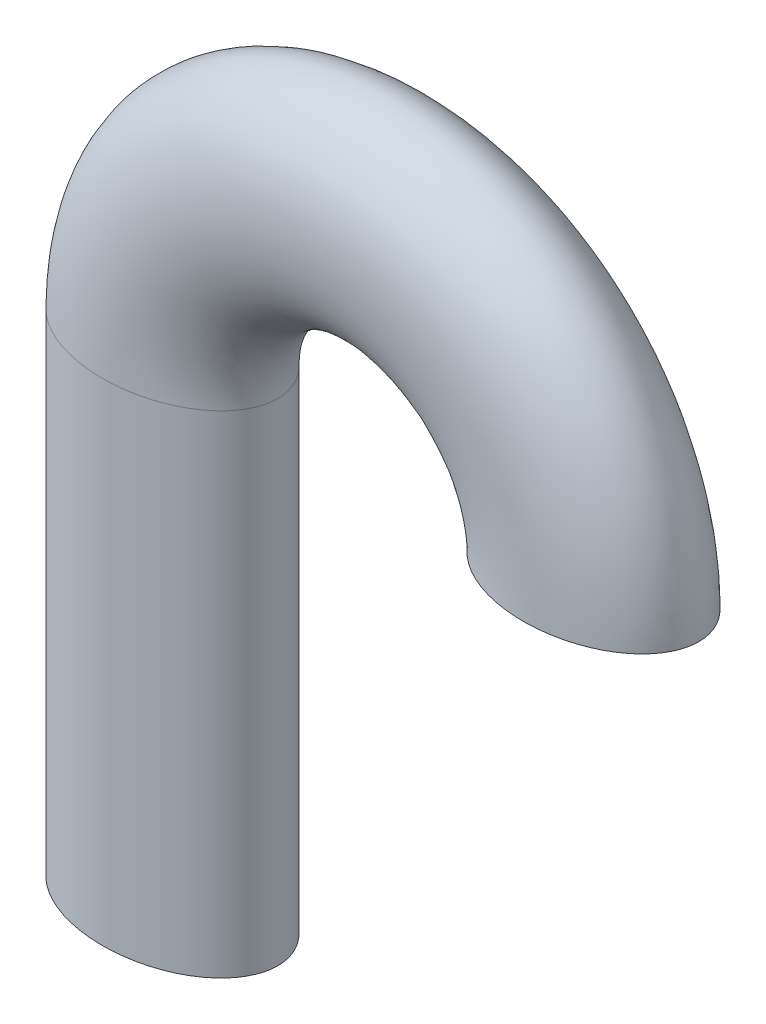
ISO-10303-21;
HEADER;
FILE_DESCRIPTION(('STEP AP214'),'2;1');
FILE_NAME('part.step','',(''),(''),'','','');
FILE_SCHEMA(('AUTOMOTIVE_DESIGN { 1 0 10303 214 1 1 1 1 }'));
ENDSEC;
DATA;
#1=APPLICATION_CONTEXT('core data for automotive mechanical design processes');
#2=APPLICATION_PROTOCOL_DEFINITION('international standard','automotive_design',2000,#1);
#3=PRODUCT_CONTEXT('',#1,'mechanical');
#4=PRODUCT('Part','Part','',(#3));
#5=PRODUCT_RELATED_PRODUCT_CATEGORY('part','',(#4));
#6=PRODUCT_DEFINITION_FORMATION('','',#4);
#7=PRODUCT_DEFINITION_CONTEXT('part definition',#1,'design');
#8=PRODUCT_DEFINITION('design','',#6,#7);
#9=PRODUCT_DEFINITION_SHAPE('','',#8);
#10=(LENGTH_UNIT() NAMED_UNIT(*) SI_UNIT(.MILLI.,.METRE.));
#11=(NAMED_UNIT(*) PLANE_ANGLE_UNIT() SI_UNIT($,.RADIAN.));
#12=(NAMED_UNIT(*) SI_UNIT($,.STERADIAN.) SOLID_ANGLE_UNIT());
#13=UNCERTAINTY_MEASURE_WITH_UNIT(LENGTH_MEASURE(1.E-05),#10,'distance_accuracy_value','');
#14=(GEOMETRIC_REPRESENTATION_CONTEXT(3) GLOBAL_UNCERTAINTY_ASSIGNED_CONTEXT((#13)) GLOBAL_UNIT_ASSIGNED_CONTEXT((#10,
#11,#12)) REPRESENTATION_CONTEXT('',''));
#15=CARTESIAN_POINT('',(0.,0.,0.));
#16=DIRECTION('',(0.,0.,1.));
#17=DIRECTION('',(1.,0.,0.));
#18=AXIS2_PLACEMENT_3D('',#15,#16,#17);
#19=CARTESIAN_POINT('',(0.,0.,0.));
#20=DIRECTION('',(0.,1.,0.));
#21=DIRECTION('',(0.,0.,1.));
#22=AXIS2_PLACEMENT_3D('',#19,#20,#21);
#23=PLANE('',#22);
#24=CARTESIAN_POINT('',(0.,0.,0.));
#25=DIRECTION('',(0.,1.,0.));
#26=DIRECTION('',(-1.,0.,0.));
#27=AXIS2_PLACEMENT_3D('',#24,#25,#26);
#28=ELLIPSE('',#27,6.,4.);
#29=CARTESIAN_POINT('',(-6.,0.,0.));
#30=VERTEX_POINT('',#29);
#31=EDGE_CURVE('E53',#30,#30,#28,.T.);
#32=ORIENTED_EDGE('',*,*,#31,.F.);
#33=EDGE_LOOP('',(#32));
#34=FACE_BOUND('',#33,.T.);
#35=ADVANCED_FACE('F41',(#34),#23,.F.);
#36=CARTESIAN_POINT('',(24.,28.,0.));
#37=DIRECTION('',(0.,-1.,0.));
#38=DIRECTION('',(0.,0.,1.));
#39=AXIS2_PLACEMENT_3D('',#36,#37,#38);
#40=PLANE('',#39);
#41=CARTESIAN_POINT('',(24.,28.,0.));
#42=DIRECTION('',(0.,-1.,0.));
#43=DIRECTION('',(1.,0.,0.));
#44=AXIS2_PLACEMENT_3D('',#41,#42,#43);
#45=ELLIPSE('',#44,6.,4.);
#46=CARTESIAN_POINT('',(30.,28.,0.));
#47=VERTEX_POINT('',#46);
#48=EDGE_CURVE('E10',#47,#47,#45,.T.);
#49=ORIENTED_EDGE('',*,*,#48,.T.);
#50=EDGE_LOOP('',(#49));
#51=FACE_BOUND('',#50,.T.);
#52=ADVANCED_FACE('F64',(#51),#40,.T.);
#53=CARTESIAN_POINT('',(-6.,0.,0.));
#54=CARTESIAN_POINT('',(-6.,28.,0.));
#55=CARTESIAN_POINT('',(-6.,0.,8.));
#56=CARTESIAN_POINT('',(-6.,28.,8.));
#57=CARTESIAN_POINT('',(6.,0.,8.));
#58=CARTESIAN_POINT('',(6.,28.,8.));
#59=CARTESIAN_POINT('',(6.,0.,0.));
#60=CARTESIAN_POINT('',(6.,28.,0.));
#61=CARTESIAN_POINT('',(6.,0.,-8.));
#62=CARTESIAN_POINT('',(6.,28.,-8.));
#63=CARTESIAN_POINT('',(-6.,0.,-8.));
#64=CARTESIAN_POINT('',(-6.,28.,-8.));
#65=CARTESIAN_POINT('',(-6.,0.,0.));
#66=CARTESIAN_POINT('',(-6.,28.,0.));
#67=(BOUNDED_SURFACE() B_SPLINE_SURFACE(3,1,((#53,#54),(#55,#56),(#57,#58),(#59,#60),(#61,#62),
(#63,#64),(#65,#66)),.UNSPECIFIED.,.T.,.F.,.F.) B_SPLINE_SURFACE_WITH_KNOTS((4,3,4),(2,2),(0.,
0.5,1.),(0.,1.),.UNSPECIFIED.) GEOMETRIC_REPRESENTATION_ITEM() RATIONAL_B_SPLINE_SURFACE(((1.,
1.),(0.333333333333333,0.333333333333333),(0.333333333333333,0.333333333333333),(1.,1.),
(0.333333333333333,0.333333333333333),(0.333333333333333,0.333333333333333),(1.,1.))) REPRESENTATION_ITEM('') SURFACE());
#68=CARTESIAN_POINT('',(0.,28.,0.));
#69=DIRECTION('',(0.,1.,0.));
#70=DIRECTION('',(-1.,0.,0.));
#71=AXIS2_PLACEMENT_3D('',#68,#69,#70);
#72=ELLIPSE('',#71,6.,4.);
#73=CARTESIAN_POINT('',(-6.,28.,0.));
#74=VERTEX_POINT('',#73);
#75=EDGE_CURVE('E48',#74,#74,#72,.T.);
#76=ORIENTED_EDGE('',*,*,#75,.F.);
#77=EDGE_LOOP('',(#76));
#78=FACE_BOUND('',#77,.T.);
#79=ORIENTED_EDGE('',*,*,#31,.T.);
#80=EDGE_LOOP('',(#79));
#81=FACE_BOUND('',#80,.T.);
#82=ADVANCED_FACE('F61',(#78,#81),#67,.T.);
#83=CARTESIAN_POINT('',(-6.,28.,0.));
#84=CARTESIAN_POINT('',(-6.,64.,0.));
#85=CARTESIAN_POINT('',(30.,64.,0.));
#86=CARTESIAN_POINT('',(30.,28.,0.));
#87=CARTESIAN_POINT('',(-6.,28.,8.));
#88=CARTESIAN_POINT('',(-6.,64.,8.));
#89=CARTESIAN_POINT('',(30.,64.,8.));
#90=CARTESIAN_POINT('',(30.,28.,8.));
#91=CARTESIAN_POINT('',(6.,28.,8.));
#92=CARTESIAN_POINT('',(6.,40.,8.));
#93=CARTESIAN_POINT('',(18.,40.,8.));
#94=CARTESIAN_POINT('',(18.,28.,8.));
#95=CARTESIAN_POINT('',(6.,28.,0.));
#96=CARTESIAN_POINT('',(6.,40.,0.));
#97=CARTESIAN_POINT('',(18.,40.,0.));
#98=CARTESIAN_POINT('',(18.,28.,0.));
#99=CARTESIAN_POINT('',(6.,28.,-8.));
#100=CARTESIAN_POINT('',(6.,40.,-8.));
#101=CARTESIAN_POINT('',(18.,40.,-8.));
#102=CARTESIAN_POINT('',(18.,28.,-8.));
#103=CARTESIAN_POINT('',(-6.,28.,-8.));
#104=CARTESIAN_POINT('',(-6.,64.,-8.));
#105=CARTESIAN_POINT('',(30.,64.,-8.));
#106=CARTESIAN_POINT('',(30.,28.,-8.));
#107=CARTESIAN_POINT('',(-6.,28.,0.));
#108=CARTESIAN_POINT('',(-6.,64.,0.));
#109=CARTESIAN_POINT('',(30.,64.,0.));
#110=CARTESIAN_POINT('',(30.,28.,0.));
#111=(BOUNDED_SURFACE() B_SPLINE_SURFACE(3,3,((#83,#84,#85,#86),(#87,#88,#89,#90),(#91,#92,#93,
#94),(#95,#96,#97,#98),(#99,#100,#101,#102),(#103,#104,#105,#106),(#107,#108,#109,#110)),
.UNSPECIFIED.,.T.,.F.,.F.) B_SPLINE_SURFACE_WITH_KNOTS((4,3,4),(4,4),(0.,0.5,1.),(0.,1.),
.UNSPECIFIED.) GEOMETRIC_REPRESENTATION_ITEM() RATIONAL_B_SPLINE_SURFACE(((1.,0.333333333333333,
0.333333333333333,1.),(0.333333333333333,0.111111111111111,0.111111111111111,0.333333333333333),
(0.333333333333333,0.111111111111111,0.111111111111111,0.333333333333333),(1.,0.333333333333333,
0.333333333333333,1.),(0.333333333333333,0.111111111111111,0.111111111111111,0.333333333333333),
(0.333333333333333,0.111111111111111,0.111111111111111,0.333333333333333),(1.,0.333333333333333,
0.333333333333333,1.))) REPRESENTATION_ITEM('') SURFACE());
#112=ORIENTED_EDGE('',*,*,#48,.F.);
#113=EDGE_LOOP('',(#112));
#114=FACE_BOUND('',#113,.T.);
#115=ORIENTED_EDGE('',*,*,#75,.T.);
#116=EDGE_LOOP('',(#115));
#117=FACE_BOUND('',#116,.T.);
#118=ADVANCED_FACE('F68',(#114,#117),#111,.T.);
#119=CLOSED_SHELL('',(#35,#52,#82,#118));
#120=MANIFOLD_SOLID_BREP('B2',#119);
#121=ADVANCED_BREP_SHAPE_REPRESENTATION('',(#18,#120),#14);
#122=SHAPE_DEFINITION_REPRESENTATION(#9,#121);
ENDSEC;
END-ISO-10303-21;
